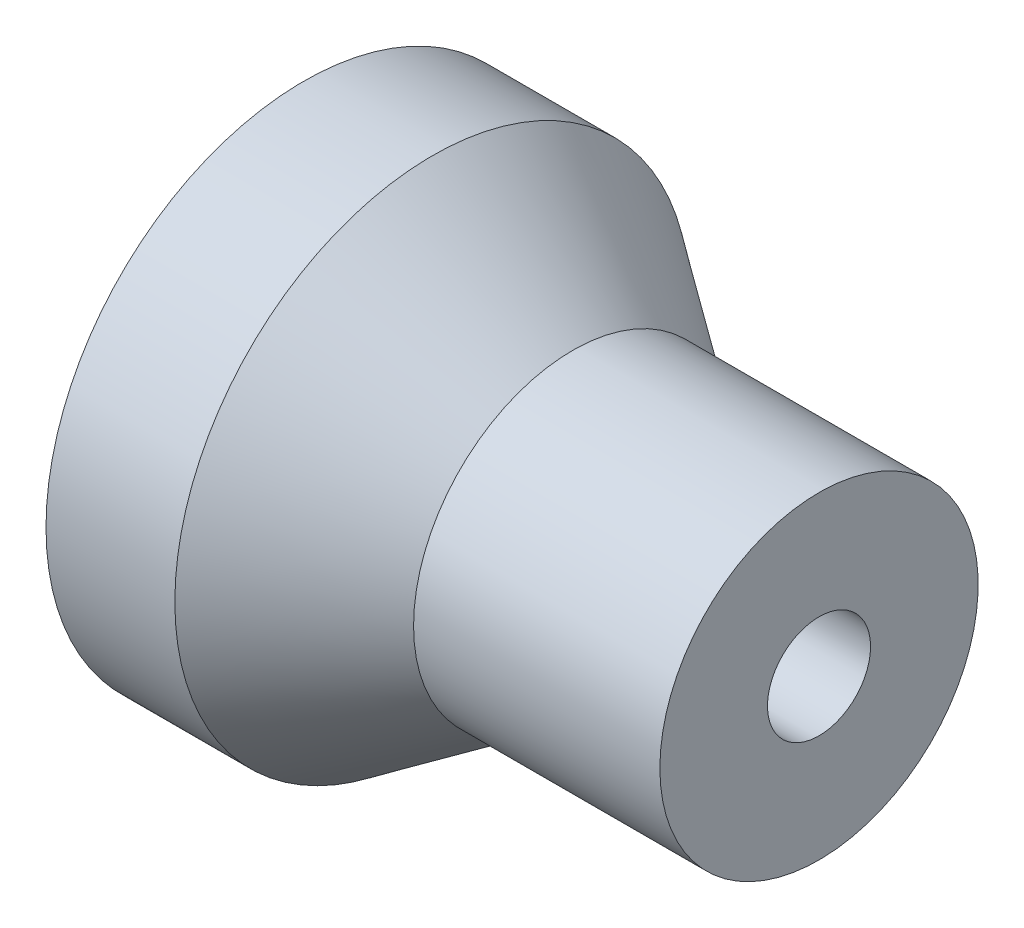
ISO-10303-21;
HEADER;
FILE_DESCRIPTION(('STEP AP214'),'2;1');
FILE_NAME('part.step','',(''),(''),'','','');
FILE_SCHEMA(('AUTOMOTIVE_DESIGN { 1 0 10303 214 1 1 1 1 }'));
ENDSEC;
DATA;
#1=APPLICATION_CONTEXT('core data for automotive mechanical design processes');
#2=APPLICATION_PROTOCOL_DEFINITION('international standard','automotive_design',2000,#1);
#3=PRODUCT_CONTEXT('',#1,'mechanical');
#4=PRODUCT('Part','Part','',(#3));
#5=PRODUCT_RELATED_PRODUCT_CATEGORY('part','',(#4));
#6=PRODUCT_DEFINITION_FORMATION('','',#4);
#7=PRODUCT_DEFINITION_CONTEXT('part definition',#1,'design');
#8=PRODUCT_DEFINITION('design','',#6,#7);
#9=PRODUCT_DEFINITION_SHAPE('','',#8);
#10=(LENGTH_UNIT() NAMED_UNIT(*) SI_UNIT(.MILLI.,.METRE.));
#11=(NAMED_UNIT(*) PLANE_ANGLE_UNIT() SI_UNIT($,.RADIAN.));
#12=(NAMED_UNIT(*) SI_UNIT($,.STERADIAN.) SOLID_ANGLE_UNIT());
#13=UNCERTAINTY_MEASURE_WITH_UNIT(LENGTH_MEASURE(1.E-05),#10,'distance_accuracy_value','');
#14=(GEOMETRIC_REPRESENTATION_CONTEXT(3) GLOBAL_UNCERTAINTY_ASSIGNED_CONTEXT((#13)) GLOBAL_UNIT_ASSIGNED_CONTEXT((#10,
#11,#12)) REPRESENTATION_CONTEXT('',''));
#15=CARTESIAN_POINT('',(0.,0.,0.));
#16=DIRECTION('',(0.,0.,1.));
#17=DIRECTION('',(1.,0.,0.));
#18=AXIS2_PLACEMENT_3D('',#15,#16,#17);
#19=CARTESIAN_POINT('',(-30.1470588235294,0.,0.));
#20=DIRECTION('',(1.,0.,0.));
#21=DIRECTION('',(0.,0.,-1.));
#22=AXIS2_PLACEMENT_3D('',#19,#20,#21);
#23=PLANE('',#22);
#24=CARTESIAN_POINT('',(-30.1470588235294,0.,0.));
#25=DIRECTION('',(-1.,0.,0.));
#26=DIRECTION('',(0.,0.,1.));
#27=AXIS2_PLACEMENT_3D('',#24,#25,#26);
#28=CIRCLE('',#27,4.5);
#29=CARTESIAN_POINT('',(-30.1470588235294,0.,4.5));
#30=VERTEX_POINT('',#29);
#31=EDGE_CURVE('E76',#30,#30,#28,.T.);
#32=ORIENTED_EDGE('',*,*,#31,.F.);
#33=EDGE_LOOP('',(#32));
#34=FACE_BOUND('',#33,.T.);
#35=CARTESIAN_POINT('',(-30.1470588235294,0.,0.));
#36=DIRECTION('',(-1.,0.,0.));
#37=DIRECTION('',(0.,0.,1.));
#38=AXIS2_PLACEMENT_3D('',#35,#36,#37);
#39=CIRCLE('',#38,10.);
#40=CARTESIAN_POINT('',(-30.1470588235294,0.,10.));
#41=VERTEX_POINT('',#40);
#42=EDGE_CURVE('E53',#41,#41,#39,.T.);
#43=ORIENTED_EDGE('',*,*,#42,.T.);
#44=EDGE_LOOP('',(#43));
#45=FACE_BOUND('',#44,.T.);
#46=ADVANCED_FACE('F39',(#34,#45),#23,.F.);
#47=CARTESIAN_POINT('',(-68.0882352941176,0.,0.));
#48=DIRECTION('',(-1.,0.,0.));
#49=DIRECTION('',(0.,0.,1.));
#50=AXIS2_PLACEMENT_3D('',#47,#48,#49);
#51=CYLINDRICAL_SURFACE('',#50,10.);
#52=ORIENTED_EDGE('',*,*,#42,.F.);
#53=EDGE_LOOP('',(#52));
#54=FACE_BOUND('',#53,.T.);
#55=CARTESIAN_POINT('',(-25.1470588235294,0.,0.));
#56=DIRECTION('',(-1.,0.,0.));
#57=DIRECTION('',(0.,0.,1.));
#58=AXIS2_PLACEMENT_3D('',#55,#56,#57);
#59=CIRCLE('',#58,10.);
#60=CARTESIAN_POINT('',(-25.1470588235294,0.,10.));
#61=VERTEX_POINT('',#60);
#62=EDGE_CURVE('E58',#61,#61,#59,.T.);
#63=ORIENTED_EDGE('',*,*,#62,.T.);
#64=EDGE_LOOP('',(#63));
#65=FACE_BOUND('',#64,.T.);
#66=ADVANCED_FACE('F85',(#54,#65),#51,.T.);
#67=CARTESIAN_POINT('',(-19.7058823529412,0.,0.));
#68=DIRECTION('',(-1.,0.,0.));
#69=DIRECTION('',(0.,0.,1.));
#70=AXIS2_PLACEMENT_3D('',#67,#68,#69);
#71=CONICAL_SURFACE('',#70,6.1764705882353,0.612537556610302);
#72=ORIENTED_EDGE('',*,*,#62,.F.);
#73=EDGE_LOOP('',(#72));
#74=FACE_BOUND('',#73,.T.);
#75=CARTESIAN_POINT('',(-19.7058823529412,0.,0.));
#76=DIRECTION('',(-1.,0.,0.));
#77=DIRECTION('',(0.,0.,1.));
#78=AXIS2_PLACEMENT_3D('',#75,#76,#77);
#79=CIRCLE('',#78,6.1764705882353);
#80=CARTESIAN_POINT('',(-19.7058823529412,0.,6.1764705882353));
#81=VERTEX_POINT('',#80);
#82=EDGE_CURVE('E64',#81,#81,#79,.T.);
#83=ORIENTED_EDGE('',*,*,#82,.T.);
#84=EDGE_LOOP('',(#83));
#85=FACE_BOUND('',#84,.T.);
#86=ADVANCED_FACE('F90',(#74,#85),#71,.T.);
#87=CARTESIAN_POINT('',(-68.0882352941176,0.,0.));
#88=DIRECTION('',(-1.,0.,0.));
#89=DIRECTION('',(0.,0.,1.));
#90=AXIS2_PLACEMENT_3D('',#87,#88,#89);
#91=CYLINDRICAL_SURFACE('',#90,6.1764705882353);
#92=ORIENTED_EDGE('',*,*,#82,.F.);
#93=EDGE_LOOP('',(#92));
#94=FACE_BOUND('',#93,.T.);
#95=CARTESIAN_POINT('',(-10.1470588235294,0.,0.));
#96=DIRECTION('',(-1.,0.,0.));
#97=DIRECTION('',(0.,0.,1.));
#98=AXIS2_PLACEMENT_3D('',#95,#96,#97);
#99=CIRCLE('',#98,6.1764705882353);
#100=CARTESIAN_POINT('',(-10.1470588235294,0.,6.1764705882353));
#101=VERTEX_POINT('',#100);
#102=EDGE_CURVE('E68',#101,#101,#99,.T.);
#103=ORIENTED_EDGE('',*,*,#102,.T.);
#104=EDGE_LOOP('',(#103));
#105=FACE_BOUND('',#104,.T.);
#106=ADVANCED_FACE('F96',(#94,#105),#91,.T.);
#107=CARTESIAN_POINT('',(-10.1470588235294,0.,-6.1764705882353));
#108=DIRECTION('',(-1.,0.,0.));
#109=DIRECTION('',(0.,0.,1.));
#110=AXIS2_PLACEMENT_3D('',#107,#108,#109);
#111=PLANE('',#110);
#112=CARTESIAN_POINT('',(-10.1470588235294,0.,0.));
#113=DIRECTION('',(1.,0.,0.));
#114=DIRECTION('',(0.,0.,-1.));
#115=AXIS2_PLACEMENT_3D('',#112,#113,#114);
#116=CIRCLE('',#115,2.);
#117=CARTESIAN_POINT('',(-10.1470588235294,0.,-2.));
#118=VERTEX_POINT('',#117);
#119=EDGE_CURVE('E72',#118,#118,#116,.T.);
#120=ORIENTED_EDGE('',*,*,#119,.F.);
#121=EDGE_LOOP('',(#120));
#122=FACE_BOUND('',#121,.T.);
#123=ORIENTED_EDGE('',*,*,#102,.F.);
#124=EDGE_LOOP('',(#123));
#125=FACE_BOUND('',#124,.T.);
#126=ADVANCED_FACE('F102',(#122,#125),#111,.F.);
#127=CARTESIAN_POINT('',(-28.1470588235294,0.,0.));
#128=DIRECTION('',(1.,0.,0.));
#129=DIRECTION('',(0.,0.,-1.));
#130=AXIS2_PLACEMENT_3D('',#127,#128,#129);
#131=CYLINDRICAL_SURFACE('',#130,2.);
#132=CARTESIAN_POINT('',(-25.1470588235294,0.,0.));
#133=DIRECTION('',(-1.,0.,0.));
#134=DIRECTION('',(0.,0.,1.));
#135=AXIS2_PLACEMENT_3D('',#132,#133,#134);
#136=CIRCLE('',#135,2.);
#137=CARTESIAN_POINT('',(-25.1470588235294,0.,2.));
#138=VERTEX_POINT('',#137);
#139=EDGE_CURVE('E48',#138,#138,#136,.T.);
#140=ORIENTED_EDGE('',*,*,#139,.T.);
#141=EDGE_LOOP('',(#140));
#142=FACE_BOUND('',#141,.T.);
#143=ORIENTED_EDGE('',*,*,#119,.T.);
#144=EDGE_LOOP('',(#143));
#145=FACE_BOUND('',#144,.T.);
#146=ADVANCED_FACE('F107',(#142,#145),#131,.F.);
#147=CARTESIAN_POINT('',(-28.1470588235294,0.,0.));
#148=DIRECTION('',(-1.,0.,0.));
#149=DIRECTION('',(0.,0.,1.));
#150=AXIS2_PLACEMENT_3D('',#147,#148,#149);
#151=CYLINDRICAL_SURFACE('',#150,4.5);
#152=CARTESIAN_POINT('',(-27.6470588235294,0.,0.));
#153=DIRECTION('',(-1.,0.,0.));
#154=DIRECTION('',(0.,0.,1.));
#155=AXIS2_PLACEMENT_3D('',#152,#153,#154);
#156=CIRCLE('',#155,4.5);
#157=CARTESIAN_POINT('',(-27.6470588235294,0.,4.5));
#158=VERTEX_POINT('',#157);
#159=EDGE_CURVE('E10',#158,#158,#156,.F.);
#160=ORIENTED_EDGE('',*,*,#159,.T.);
#161=EDGE_LOOP('',(#160));
#162=FACE_BOUND('',#161,.T.);
#163=ORIENTED_EDGE('',*,*,#31,.T.);
#164=EDGE_LOOP('',(#163));
#165=FACE_BOUND('',#164,.T.);
#166=ADVANCED_FACE('F81',(#162,#165),#151,.F.);
#167=CARTESIAN_POINT('',(-28.1470588235294,0.,0.));
#168=DIRECTION('',(-1.,0.,0.));
#169=DIRECTION('',(0.,0.,1.));
#170=AXIS2_PLACEMENT_3D('',#167,#168,#169);
#171=CONICAL_SURFACE('',#170,5.00000000000005,0.785398163397454);
#172=ORIENTED_EDGE('',*,*,#139,.F.);
#173=EDGE_LOOP('',(#172));
#174=FACE_BOUND('',#173,.T.);
#175=ORIENTED_EDGE('',*,*,#159,.F.);
#176=EDGE_LOOP('',(#175));
#177=FACE_BOUND('',#176,.T.);
#178=ADVANCED_FACE('F42',(#174,#177),#171,.F.);
#179=CLOSED_SHELL('',(#46,#66,#86,#106,#126,#146,#166,#178));
#180=MANIFOLD_SOLID_BREP('B2',#179);
#181=ADVANCED_BREP_SHAPE_REPRESENTATION('',(#18,#180),#14);
#182=SHAPE_DEFINITION_REPRESENTATION(#9,#181);
ENDSEC;
END-ISO-10303-21;
